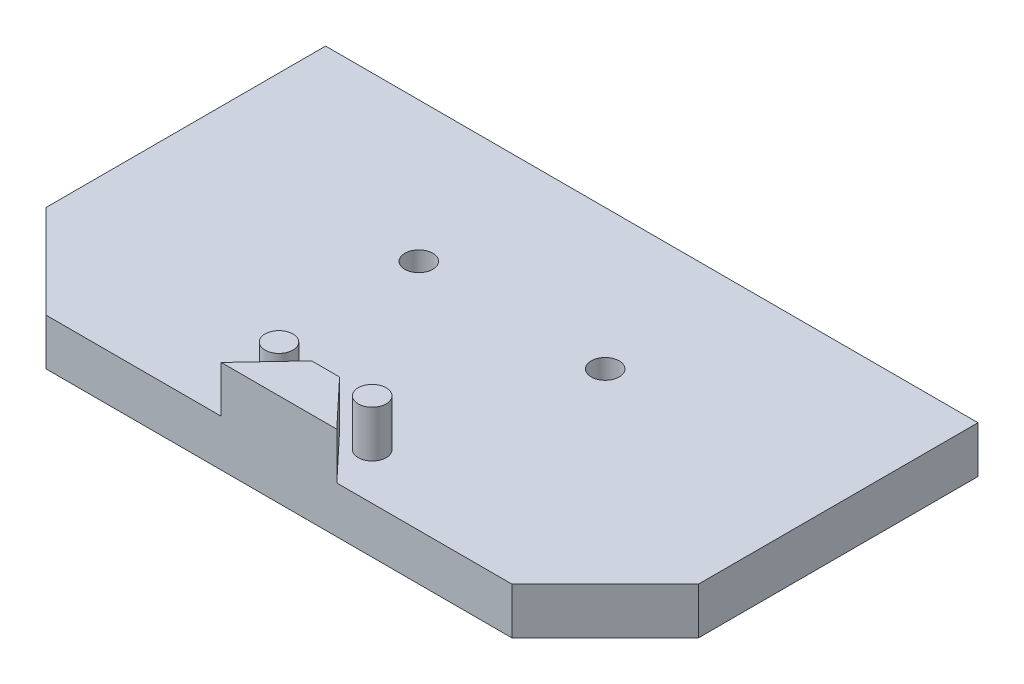
ISO-10303-21;
HEADER;
FILE_DESCRIPTION(('STEP AP214'),'2;1');
FILE_NAME('part.step','',(''),(''),'','','');
FILE_SCHEMA(('AUTOMOTIVE_DESIGN { 1 0 10303 214 1 1 1 1 }'));
ENDSEC;
DATA;
#1=APPLICATION_CONTEXT('core data for automotive mechanical design processes');
#2=APPLICATION_PROTOCOL_DEFINITION('international standard','automotive_design',2000,#1);
#3=PRODUCT_CONTEXT('',#1,'mechanical');
#4=PRODUCT('Part','Part','',(#3));
#5=PRODUCT_RELATED_PRODUCT_CATEGORY('part','',(#4));
#6=PRODUCT_DEFINITION_FORMATION('','',#4);
#7=PRODUCT_DEFINITION_CONTEXT('part definition',#1,'design');
#8=PRODUCT_DEFINITION('design','',#6,#7);
#9=PRODUCT_DEFINITION_SHAPE('','',#8);
#10=(LENGTH_UNIT() NAMED_UNIT(*) SI_UNIT(.MILLI.,.METRE.));
#11=(NAMED_UNIT(*) PLANE_ANGLE_UNIT() SI_UNIT($,.RADIAN.));
#12=(NAMED_UNIT(*) SI_UNIT($,.STERADIAN.) SOLID_ANGLE_UNIT());
#13=UNCERTAINTY_MEASURE_WITH_UNIT(LENGTH_MEASURE(1.E-05),#10,'distance_accuracy_value','');
#14=(GEOMETRIC_REPRESENTATION_CONTEXT(3) GLOBAL_UNCERTAINTY_ASSIGNED_CONTEXT((#13)) GLOBAL_UNIT_ASSIGNED_CONTEXT((#10,
#11,#12)) REPRESENTATION_CONTEXT('',''));
#15=CARTESIAN_POINT('',(0.,0.,0.));
#16=DIRECTION('',(0.,0.,1.));
#17=DIRECTION('',(1.,0.,0.));
#18=AXIS2_PLACEMENT_3D('',#15,#16,#17);
#19=CARTESIAN_POINT('',(0.,5.,0.));
#20=DIRECTION('',(0.,1.,0.));
#21=DIRECTION('',(0.,0.,1.));
#22=AXIS2_PLACEMENT_3D('',#19,#20,#21);
#23=PLANE('',#22);
#24=CARTESIAN_POINT('',(5.,5.,15.));
#25=DIRECTION('',(0.,1.,0.));
#26=DIRECTION('',(0.,0.,1.));
#27=AXIS2_PLACEMENT_3D('',#24,#25,#26);
#28=CIRCLE('',#27,1.5);
#29=CARTESIAN_POINT('',(5.,5.,16.5));
#30=VERTEX_POINT('',#29);
#31=EDGE_CURVE('E151',#30,#30,#28,.T.);
#32=ORIENTED_EDGE('',*,*,#31,.F.);
#33=EDGE_LOOP('',(#32));
#34=FACE_BOUND('',#33,.T.);
#35=CARTESIAN_POINT('',(-10.,5.,-5.00000000000001));
#36=DIRECTION('',(0.,1.,0.));
#37=DIRECTION('',(0.,0.,1.));
#38=AXIS2_PLACEMENT_3D('',#35,#36,#37);
#39=CIRCLE('',#38,1.5);
#40=CARTESIAN_POINT('',(-10.,5.,-3.50000000000001));
#41=VERTEX_POINT('',#40);
#42=EDGE_CURVE('E168',#41,#41,#39,.T.);
#43=ORIENTED_EDGE('',*,*,#42,.F.);
#44=EDGE_LOOP('',(#43));
#45=FACE_BOUND('',#44,.T.);
#46=CARTESIAN_POINT('',(10.,5.,-5.00000000000001));
#47=DIRECTION('',(0.,1.,0.));
#48=DIRECTION('',(0.,0.,1.));
#49=AXIS2_PLACEMENT_3D('',#46,#47,#48);
#50=CIRCLE('',#49,1.5);
#51=CARTESIAN_POINT('',(10.,5.,-3.50000000000001));
#52=VERTEX_POINT('',#51);
#53=EDGE_CURVE('E162',#52,#52,#50,.T.);
#54=ORIENTED_EDGE('',*,*,#53,.F.);
#55=EDGE_LOOP('',(#54));
#56=FACE_BOUND('',#55,.T.);
#57=CARTESIAN_POINT('',(-5.,5.,15.));
#58=DIRECTION('',(0.,1.,0.));
#59=DIRECTION('',(0.,0.,1.));
#60=AXIS2_PLACEMENT_3D('',#57,#58,#59);
#61=CIRCLE('',#60,1.5);
#62=CARTESIAN_POINT('',(-5.,5.,16.5));
#63=VERTEX_POINT('',#62);
#64=EDGE_CURVE('E156',#63,#63,#61,.T.);
#65=ORIENTED_EDGE('',*,*,#64,.F.);
#66=EDGE_LOOP('',(#65));
#67=FACE_BOUND('',#66,.T.);
#68=DIRECTION('',(1.,0.,0.));
#69=VECTOR('',#68,1.);
#70=CARTESIAN_POINT('',(35.,5.,20.));
#71=LINE('',#70,#69);
#72=CARTESIAN_POINT('',(-25.,5.,20.));
#73=VERTEX_POINT('',#72);
#74=CARTESIAN_POINT('',(-6.2,5.,20.));
#75=VERTEX_POINT('',#74);
#76=EDGE_CURVE('E182',#73,#75,#71,.T.);
#77=ORIENTED_EDGE('',*,*,#76,.T.);
#78=DIRECTION('',(-0.684910008767886,0.,0.728627668902008));
#79=VECTOR('',#78,1.);
#80=CARTESIAN_POINT('',(-1.5,5.,15.));
#81=LINE('',#80,#79);
#82=CARTESIAN_POINT('',(-1.5,5.,15.));
#83=VERTEX_POINT('',#82);
#84=EDGE_CURVE('E53',#83,#75,#81,.T.);
#85=ORIENTED_EDGE('',*,*,#84,.F.);
#86=DIRECTION('',(-1.,0.,0.));
#87=VECTOR('',#86,1.);
#88=CARTESIAN_POINT('',(1.5,5.,15.));
#89=LINE('',#88,#87);
#90=CARTESIAN_POINT('',(1.5,5.,15.));
#91=VERTEX_POINT('',#90);
#92=EDGE_CURVE('E48',#91,#83,#89,.T.);
#93=ORIENTED_EDGE('',*,*,#92,.F.);
#94=DIRECTION('',(-0.684910008767887,0.,-0.728627668902007));
#95=VECTOR('',#94,1.);
#96=CARTESIAN_POINT('',(6.2,5.,20.));
#97=LINE('',#96,#95);
#98=CARTESIAN_POINT('',(6.2,5.,20.));
#99=VERTEX_POINT('',#98);
#100=EDGE_CURVE('E223',#99,#91,#97,.T.);
#101=ORIENTED_EDGE('',*,*,#100,.F.);
#102=CARTESIAN_POINT('',(25.,5.,20.));
#103=VERTEX_POINT('',#102);
#104=EDGE_CURVE('E180',#99,#103,#71,.T.);
#105=ORIENTED_EDGE('',*,*,#104,.T.);
#106=DIRECTION('',(-0.707106781186547,0.,0.707106781186548));
#107=VECTOR('',#106,1.);
#108=CARTESIAN_POINT('',(25.,5.,20.));
#109=LINE('',#108,#107);
#110=CARTESIAN_POINT('',(35.,5.,9.99999999999999));
#111=VERTEX_POINT('',#110);
#112=EDGE_CURVE('E132',#111,#103,#109,.T.);
#113=ORIENTED_EDGE('',*,*,#112,.F.);
#114=DIRECTION('',(0.,0.,-1.));
#115=VECTOR('',#114,1.);
#116=CARTESIAN_POINT('',(35.,5.,20.));
#117=LINE('',#116,#115);
#118=CARTESIAN_POINT('',(35.,5.,-20.));
#119=VERTEX_POINT('',#118);
#120=EDGE_CURVE('E184',#111,#119,#117,.T.);
#121=ORIENTED_EDGE('',*,*,#120,.T.);
#122=DIRECTION('',(-1.,0.,0.));
#123=VECTOR('',#122,1.);
#124=CARTESIAN_POINT('',(35.,5.,-20.));
#125=LINE('',#124,#123);
#126=CARTESIAN_POINT('',(-35.,5.,-20.));
#127=VERTEX_POINT('',#126);
#128=EDGE_CURVE('E186',#119,#127,#125,.T.);
#129=ORIENTED_EDGE('',*,*,#128,.T.);
#130=DIRECTION('',(0.,0.,1.));
#131=VECTOR('',#130,1.);
#132=CARTESIAN_POINT('',(-35.,5.,20.));
#133=LINE('',#132,#131);
#134=CARTESIAN_POINT('',(-35.,5.,10.));
#135=VERTEX_POINT('',#134);
#136=EDGE_CURVE('E177',#127,#135,#133,.T.);
#137=ORIENTED_EDGE('',*,*,#136,.T.);
#138=DIRECTION('',(-0.707106781186548,0.,-0.707106781186547));
#139=VECTOR('',#138,1.);
#140=CARTESIAN_POINT('',(-25.,5.,20.));
#141=LINE('',#140,#139);
#142=EDGE_CURVE('E144',#73,#135,#141,.T.);
#143=ORIENTED_EDGE('',*,*,#142,.F.);
#144=EDGE_LOOP('',(#77,#85,#93,#101,#105,#113,#121,#129,#137,#143));
#145=FACE_BOUND('',#144,.T.);
#146=ADVANCED_FACE('F33',(#34,#45,#56,#67,#145),#23,.T.);
#147=CARTESIAN_POINT('',(-35.,5.,20.));
#148=DIRECTION('',(1.,0.,0.));
#149=DIRECTION('',(0.,0.,-1.));
#150=AXIS2_PLACEMENT_3D('',#147,#148,#149);
#151=PLANE('',#150);
#152=DIRECTION('',(0.,0.,1.));
#153=VECTOR('',#152,1.);
#154=CARTESIAN_POINT('',(-35.,0.,20.));
#155=LINE('',#154,#153);
#156=CARTESIAN_POINT('',(-35.,0.,-20.));
#157=VERTEX_POINT('',#156);
#158=CARTESIAN_POINT('',(-35.,0.,10.));
#159=VERTEX_POINT('',#158);
#160=EDGE_CURVE('E174',#157,#159,#155,.T.);
#161=ORIENTED_EDGE('',*,*,#160,.T.);
#162=DIRECTION('',(0.,1.,0.));
#163=VECTOR('',#162,1.);
#164=CARTESIAN_POINT('',(-35.,-5.,10.));
#165=LINE('',#164,#163);
#166=EDGE_CURVE('E148',#159,#135,#165,.T.);
#167=ORIENTED_EDGE('',*,*,#166,.T.);
#168=ORIENTED_EDGE('',*,*,#136,.F.);
#169=DIRECTION('',(0.,-1.,0.));
#170=VECTOR('',#169,1.);
#171=CARTESIAN_POINT('',(-35.,5.,-20.));
#172=LINE('',#171,#170);
#173=EDGE_CURVE('E188',#127,#157,#172,.T.);
#174=ORIENTED_EDGE('',*,*,#173,.T.);
#175=EDGE_LOOP('',(#161,#167,#168,#174));
#176=FACE_BOUND('',#175,.T.);
#177=ADVANCED_FACE('F35',(#176),#151,.F.);
#178=CARTESIAN_POINT('',(35.,5.,20.));
#179=DIRECTION('',(0.,0.,-1.));
#180=DIRECTION('',(-1.,0.,0.));
#181=AXIS2_PLACEMENT_3D('',#178,#179,#180);
#182=PLANE('',#181);
#183=DIRECTION('',(1.,0.,0.));
#184=VECTOR('',#183,1.);
#185=CARTESIAN_POINT('',(35.,0.,20.));
#186=LINE('',#185,#184);
#187=CARTESIAN_POINT('',(-25.,0.,20.));
#188=VERTEX_POINT('',#187);
#189=CARTESIAN_POINT('',(25.,0.,20.));
#190=VERTEX_POINT('',#189);
#191=EDGE_CURVE('E191',#188,#190,#186,.T.);
#192=ORIENTED_EDGE('',*,*,#191,.T.);
#193=DIRECTION('',(0.,1.,0.));
#194=VECTOR('',#193,1.);
#195=CARTESIAN_POINT('',(25.,-5.,20.));
#196=LINE('',#195,#194);
#197=EDGE_CURVE('E141',#190,#103,#196,.T.);
#198=ORIENTED_EDGE('',*,*,#197,.T.);
#199=ORIENTED_EDGE('',*,*,#104,.F.);
#200=DIRECTION('',(0.,-1.,0.));
#201=VECTOR('',#200,1.);
#202=CARTESIAN_POINT('',(6.2,10.,20.));
#203=LINE('',#202,#201);
#204=CARTESIAN_POINT('',(6.2,10.,20.));
#205=VERTEX_POINT('',#204);
#206=EDGE_CURVE('E117',#205,#99,#203,.T.);
#207=ORIENTED_EDGE('',*,*,#206,.F.);
#208=DIRECTION('',(1.,0.,0.));
#209=VECTOR('',#208,1.);
#210=CARTESIAN_POINT('',(-6.2,10.,20.));
#211=LINE('',#210,#209);
#212=CARTESIAN_POINT('',(-6.2,10.,20.));
#213=VERTEX_POINT('',#212);
#214=EDGE_CURVE('E109',#213,#205,#211,.T.);
#215=ORIENTED_EDGE('',*,*,#214,.F.);
#216=DIRECTION('',(0.,-1.,0.));
#217=VECTOR('',#216,1.);
#218=CARTESIAN_POINT('',(-6.2,10.,20.));
#219=LINE('',#218,#217);
#220=EDGE_CURVE('E115',#213,#75,#219,.T.);
#221=ORIENTED_EDGE('',*,*,#220,.T.);
#222=ORIENTED_EDGE('',*,*,#76,.F.);
#223=DIRECTION('',(0.,1.,0.));
#224=VECTOR('',#223,1.);
#225=CARTESIAN_POINT('',(-25.,-5.,20.));
#226=LINE('',#225,#224);
#227=EDGE_CURVE('E147',#188,#73,#226,.T.);
#228=ORIENTED_EDGE('',*,*,#227,.F.);
#229=EDGE_LOOP('',(#192,#198,#199,#207,#215,#221,#222,#228));
#230=FACE_BOUND('',#229,.T.);
#231=ADVANCED_FACE('F112',(#230),#182,.F.);
#232=CARTESIAN_POINT('',(35.,5.,20.));
#233=DIRECTION('',(-1.,0.,0.));
#234=DIRECTION('',(0.,0.,1.));
#235=AXIS2_PLACEMENT_3D('',#232,#233,#234);
#236=PLANE('',#235);
#237=ORIENTED_EDGE('',*,*,#120,.F.);
#238=DIRECTION('',(0.,1.,0.));
#239=VECTOR('',#238,1.);
#240=CARTESIAN_POINT('',(35.,-5.,9.99999999999999));
#241=LINE('',#240,#239);
#242=CARTESIAN_POINT('',(35.,0.,9.99999999999999));
#243=VERTEX_POINT('',#242);
#244=EDGE_CURVE('E135',#243,#111,#241,.T.);
#245=ORIENTED_EDGE('',*,*,#244,.F.);
#246=DIRECTION('',(0.,0.,-1.));
#247=VECTOR('',#246,1.);
#248=CARTESIAN_POINT('',(35.,0.,20.));
#249=LINE('',#248,#247);
#250=CARTESIAN_POINT('',(35.,0.,-20.));
#251=VERTEX_POINT('',#250);
#252=EDGE_CURVE('E193',#243,#251,#249,.T.);
#253=ORIENTED_EDGE('',*,*,#252,.T.);
#254=DIRECTION('',(0.,-1.,0.));
#255=VECTOR('',#254,1.);
#256=CARTESIAN_POINT('',(35.,5.,-20.));
#257=LINE('',#256,#255);
#258=EDGE_CURVE('E198',#119,#251,#257,.T.);
#259=ORIENTED_EDGE('',*,*,#258,.F.);
#260=EDGE_LOOP('',(#237,#245,#253,#259));
#261=FACE_BOUND('',#260,.T.);
#262=ADVANCED_FACE('F219',(#261),#236,.F.);
#263=CARTESIAN_POINT('',(35.,5.,-20.));
#264=DIRECTION('',(0.,0.,1.));
#265=DIRECTION('',(1.,0.,0.));
#266=AXIS2_PLACEMENT_3D('',#263,#264,#265);
#267=PLANE('',#266);
#268=DIRECTION('',(-1.,0.,0.));
#269=VECTOR('',#268,1.);
#270=CARTESIAN_POINT('',(35.,0.,-20.));
#271=LINE('',#270,#269);
#272=EDGE_CURVE('E181',#251,#157,#271,.T.);
#273=ORIENTED_EDGE('',*,*,#272,.T.);
#274=ORIENTED_EDGE('',*,*,#173,.F.);
#275=ORIENTED_EDGE('',*,*,#128,.F.);
#276=ORIENTED_EDGE('',*,*,#258,.T.);
#277=EDGE_LOOP('',(#273,#274,#275,#276));
#278=FACE_BOUND('',#277,.T.);
#279=ADVANCED_FACE('F214',(#278),#267,.F.);
#280=CARTESIAN_POINT('',(0.,0.,0.));
#281=DIRECTION('',(0.,1.,0.));
#282=DIRECTION('',(0.,0.,1.));
#283=AXIS2_PLACEMENT_3D('',#280,#281,#282);
#284=PLANE('',#283);
#285=CARTESIAN_POINT('',(10.,0.,-5.00000000000001));
#286=DIRECTION('',(0.,1.,0.));
#287=DIRECTION('',(0.,0.,1.));
#288=AXIS2_PLACEMENT_3D('',#285,#286,#287);
#289=CIRCLE('',#288,1.5);
#290=CARTESIAN_POINT('',(10.,0.,-3.50000000000001));
#291=VERTEX_POINT('',#290);
#292=EDGE_CURVE('E165',#291,#291,#289,.T.);
#293=ORIENTED_EDGE('',*,*,#292,.T.);
#294=EDGE_LOOP('',(#293));
#295=FACE_BOUND('',#294,.T.);
#296=CARTESIAN_POINT('',(-10.,0.,-5.00000000000001));
#297=DIRECTION('',(0.,1.,0.));
#298=DIRECTION('',(0.,0.,1.));
#299=AXIS2_PLACEMENT_3D('',#296,#297,#298);
#300=CIRCLE('',#299,1.5);
#301=CARTESIAN_POINT('',(-10.,0.,-3.50000000000001));
#302=VERTEX_POINT('',#301);
#303=EDGE_CURVE('E171',#302,#302,#300,.T.);
#304=ORIENTED_EDGE('',*,*,#303,.T.);
#305=EDGE_LOOP('',(#304));
#306=FACE_BOUND('',#305,.T.);
#307=ORIENTED_EDGE('',*,*,#252,.F.);
#308=DIRECTION('',(-0.707106781186547,0.,0.707106781186548));
#309=VECTOR('',#308,1.);
#310=CARTESIAN_POINT('',(22.5,0.,22.5));
#311=LINE('',#310,#309);
#312=EDGE_CURVE('E11',#243,#190,#311,.T.);
#313=ORIENTED_EDGE('',*,*,#312,.T.);
#314=ORIENTED_EDGE('',*,*,#191,.F.);
#315=DIRECTION('',(-0.707106781186548,0.,-0.707106781186547));
#316=VECTOR('',#315,1.);
#317=CARTESIAN_POINT('',(-22.5,0.,22.5));
#318=LINE('',#317,#316);
#319=EDGE_CURVE('E41',#188,#159,#318,.T.);
#320=ORIENTED_EDGE('',*,*,#319,.T.);
#321=ORIENTED_EDGE('',*,*,#160,.F.);
#322=ORIENTED_EDGE('',*,*,#272,.F.);
#323=EDGE_LOOP('',(#307,#313,#314,#320,#321,#322));
#324=FACE_BOUND('',#323,.T.);
#325=ADVANCED_FACE('F205',(#295,#306,#324),#284,.F.);
#326=CARTESIAN_POINT('',(-10.,0.,-5.00000000000001));
#327=DIRECTION('',(0.,1.,0.));
#328=DIRECTION('',(0.,0.,1.));
#329=AXIS2_PLACEMENT_3D('',#326,#327,#328);
#330=CYLINDRICAL_SURFACE('',#329,1.5);
#331=ORIENTED_EDGE('',*,*,#303,.F.);
#332=EDGE_LOOP('',(#331));
#333=FACE_BOUND('',#332,.T.);
#334=ORIENTED_EDGE('',*,*,#42,.T.);
#335=EDGE_LOOP('',(#334));
#336=FACE_BOUND('',#335,.T.);
#337=ADVANCED_FACE('F249',(#333,#336),#330,.F.);
#338=CARTESIAN_POINT('',(10.,0.,-5.00000000000001));
#339=DIRECTION('',(0.,1.,0.));
#340=DIRECTION('',(0.,0.,1.));
#341=AXIS2_PLACEMENT_3D('',#338,#339,#340);
#342=CYLINDRICAL_SURFACE('',#341,1.5);
#343=ORIENTED_EDGE('',*,*,#292,.F.);
#344=EDGE_LOOP('',(#343));
#345=FACE_BOUND('',#344,.T.);
#346=ORIENTED_EDGE('',*,*,#53,.T.);
#347=EDGE_LOOP('',(#346));
#348=FACE_BOUND('',#347,.T.);
#349=ADVANCED_FACE('F345',(#345,#348),#342,.F.);
#350=CARTESIAN_POINT('',(-5.,10.,15.));
#351=DIRECTION('',(0.,-1.,0.));
#352=DIRECTION('',(0.,0.,-1.));
#353=AXIS2_PLACEMENT_3D('',#350,#351,#352);
#354=CYLINDRICAL_SURFACE('',#353,1.5);
#355=CARTESIAN_POINT('',(-5.,10.,15.));
#356=DIRECTION('',(0.,1.,0.));
#357=DIRECTION('',(0.,0.,1.));
#358=AXIS2_PLACEMENT_3D('',#355,#356,#357);
#359=CIRCLE('',#358,1.5);
#360=CARTESIAN_POINT('',(-5.,10.,16.5));
#361=VERTEX_POINT('',#360);
#362=EDGE_CURVE('E159',#361,#361,#359,.T.);
#363=ORIENTED_EDGE('',*,*,#362,.F.);
#364=EDGE_LOOP('',(#363));
#365=FACE_BOUND('',#364,.T.);
#366=ORIENTED_EDGE('',*,*,#64,.T.);
#367=EDGE_LOOP('',(#366));
#368=FACE_BOUND('',#367,.T.);
#369=ADVANCED_FACE('F336',(#365,#368),#354,.T.);
#370=CARTESIAN_POINT('',(-5.,10.,15.));
#371=DIRECTION('',(0.,1.,0.));
#372=DIRECTION('',(0.,0.,1.));
#373=AXIS2_PLACEMENT_3D('',#370,#371,#372);
#374=PLANE('',#373);
#375=ORIENTED_EDGE('',*,*,#362,.T.);
#376=EDGE_LOOP('',(#375));
#377=FACE_BOUND('',#376,.T.);
#378=ADVANCED_FACE('F327',(#377),#374,.T.);
#379=CARTESIAN_POINT('',(5.,10.,15.));
#380=DIRECTION('',(0.,-1.,0.));
#381=DIRECTION('',(0.,0.,-1.));
#382=AXIS2_PLACEMENT_3D('',#379,#380,#381);
#383=CYLINDRICAL_SURFACE('',#382,1.5);
#384=CARTESIAN_POINT('',(5.,10.,15.));
#385=DIRECTION('',(0.,1.,0.));
#386=DIRECTION('',(0.,0.,1.));
#387=AXIS2_PLACEMENT_3D('',#384,#385,#386);
#388=CIRCLE('',#387,1.5);
#389=CARTESIAN_POINT('',(5.,10.,16.5));
#390=VERTEX_POINT('',#389);
#391=EDGE_CURVE('E153',#390,#390,#388,.T.);
#392=ORIENTED_EDGE('',*,*,#391,.F.);
#393=EDGE_LOOP('',(#392));
#394=FACE_BOUND('',#393,.T.);
#395=ORIENTED_EDGE('',*,*,#31,.T.);
#396=EDGE_LOOP('',(#395));
#397=FACE_BOUND('',#396,.T.);
#398=ADVANCED_FACE('F234',(#394,#397),#383,.T.);
#399=CARTESIAN_POINT('',(5.,10.,15.));
#400=DIRECTION('',(0.,1.,0.));
#401=DIRECTION('',(0.,0.,1.));
#402=AXIS2_PLACEMENT_3D('',#399,#400,#401);
#403=PLANE('',#402);
#404=ORIENTED_EDGE('',*,*,#391,.T.);
#405=EDGE_LOOP('',(#404));
#406=FACE_BOUND('',#405,.T.);
#407=ADVANCED_FACE('F227',(#406),#403,.T.);
#408=CARTESIAN_POINT('',(-25.,-5.,20.));
#409=DIRECTION('',(0.707106781186547,0.,-0.707106781186548));
#410=DIRECTION('',(-0.707106781186548,0.,-0.707106781186547));
#411=AXIS2_PLACEMENT_3D('',#408,#409,#410);
#412=PLANE('',#411);
#413=ORIENTED_EDGE('',*,*,#227,.T.);
#414=ORIENTED_EDGE('',*,*,#142,.T.);
#415=ORIENTED_EDGE('',*,*,#166,.F.);
#416=ORIENTED_EDGE('',*,*,#319,.F.);
#417=EDGE_LOOP('',(#413,#414,#415,#416));
#418=FACE_BOUND('',#417,.T.);
#419=ADVANCED_FACE('F225',(#418),#412,.F.);
#420=CARTESIAN_POINT('',(25.,-5.,20.));
#421=DIRECTION('',(-0.707106781186548,0.,-0.707106781186547));
#422=DIRECTION('',(-0.707106781186547,0.,0.707106781186548));
#423=AXIS2_PLACEMENT_3D('',#420,#421,#422);
#424=PLANE('',#423);
#425=ORIENTED_EDGE('',*,*,#244,.T.);
#426=ORIENTED_EDGE('',*,*,#112,.T.);
#427=ORIENTED_EDGE('',*,*,#197,.F.);
#428=ORIENTED_EDGE('',*,*,#312,.F.);
#429=EDGE_LOOP('',(#425,#426,#427,#428));
#430=FACE_BOUND('',#429,.T.);
#431=ADVANCED_FACE('F222',(#430),#424,.F.);
#432=CARTESIAN_POINT('',(-1.5,10.,15.));
#433=DIRECTION('',(0.728627668902008,0.,0.684910008767886));
#434=DIRECTION('',(0.684910008767886,0.,-0.728627668902008));
#435=AXIS2_PLACEMENT_3D('',#432,#433,#434);
#436=PLANE('',#435);
#437=ORIENTED_EDGE('',*,*,#84,.T.);
#438=ORIENTED_EDGE('',*,*,#220,.F.);
#439=DIRECTION('',(-0.684910008767886,0.,0.728627668902008));
#440=VECTOR('',#439,1.);
#441=CARTESIAN_POINT('',(-1.5,10.,15.));
#442=LINE('',#441,#440);
#443=CARTESIAN_POINT('',(-1.5,10.,15.));
#444=VERTEX_POINT('',#443);
#445=EDGE_CURVE('E121',#444,#213,#442,.T.);
#446=ORIENTED_EDGE('',*,*,#445,.F.);
#447=DIRECTION('',(0.,-1.,0.));
#448=VECTOR('',#447,1.);
#449=CARTESIAN_POINT('',(-1.5,10.,15.));
#450=LINE('',#449,#448);
#451=EDGE_CURVE('E406',#444,#83,#450,.T.);
#452=ORIENTED_EDGE('',*,*,#451,.T.);
#453=EDGE_LOOP('',(#437,#438,#446,#452));
#454=FACE_BOUND('',#453,.T.);
#455=ADVANCED_FACE('F131',(#454),#436,.F.);
#456=CARTESIAN_POINT('',(6.2,10.,20.));
#457=DIRECTION('',(-0.728627668902007,0.,0.684910008767887));
#458=DIRECTION('',(0.684910008767887,0.,0.728627668902007));
#459=AXIS2_PLACEMENT_3D('',#456,#457,#458);
#460=PLANE('',#459);
#461=ORIENTED_EDGE('',*,*,#100,.T.);
#462=DIRECTION('',(0.,-1.,0.));
#463=VECTOR('',#462,1.);
#464=CARTESIAN_POINT('',(1.5,10.,15.));
#465=LINE('',#464,#463);
#466=CARTESIAN_POINT('',(1.5,10.,15.));
#467=VERTEX_POINT('',#466);
#468=EDGE_CURVE('E137',#467,#91,#465,.T.);
#469=ORIENTED_EDGE('',*,*,#468,.F.);
#470=DIRECTION('',(-0.684910008767887,0.,-0.728627668902007));
#471=VECTOR('',#470,1.);
#472=CARTESIAN_POINT('',(6.2,10.,20.));
#473=LINE('',#472,#471);
#474=EDGE_CURVE('E120',#205,#467,#473,.T.);
#475=ORIENTED_EDGE('',*,*,#474,.F.);
#476=ORIENTED_EDGE('',*,*,#206,.T.);
#477=EDGE_LOOP('',(#461,#469,#475,#476));
#478=FACE_BOUND('',#477,.T.);
#479=ADVANCED_FACE('F267',(#478),#460,.F.);
#480=CARTESIAN_POINT('',(1.5,10.,15.));
#481=DIRECTION('',(0.,0.,1.));
#482=DIRECTION('',(1.,0.,0.));
#483=AXIS2_PLACEMENT_3D('',#480,#481,#482);
#484=PLANE('',#483);
#485=ORIENTED_EDGE('',*,*,#92,.T.);
#486=ORIENTED_EDGE('',*,*,#451,.F.);
#487=DIRECTION('',(-1.,0.,0.));
#488=VECTOR('',#487,1.);
#489=CARTESIAN_POINT('',(1.5,10.,15.));
#490=LINE('',#489,#488);
#491=EDGE_CURVE('E126',#467,#444,#490,.T.);
#492=ORIENTED_EDGE('',*,*,#491,.F.);
#493=ORIENTED_EDGE('',*,*,#468,.T.);
#494=EDGE_LOOP('',(#485,#486,#492,#493));
#495=FACE_BOUND('',#494,.T.);
#496=ADVANCED_FACE('F274',(#495),#484,.F.);
#497=CARTESIAN_POINT('',(0.,10.,0.));
#498=DIRECTION('',(0.,-1.,0.));
#499=DIRECTION('',(0.,0.,-1.));
#500=AXIS2_PLACEMENT_3D('',#497,#498,#499);
#501=PLANE('',#500);
#502=ORIENTED_EDGE('',*,*,#445,.T.);
#503=ORIENTED_EDGE('',*,*,#214,.T.);
#504=ORIENTED_EDGE('',*,*,#474,.T.);
#505=ORIENTED_EDGE('',*,*,#491,.T.);
#506=EDGE_LOOP('',(#502,#503,#504,#505));
#507=FACE_BOUND('',#506,.T.);
#508=ADVANCED_FACE('F124',(#507),#501,.F.);
#509=CLOSED_SHELL('',(#146,#177,#231,#262,#279,#325,#337,#349,#369,#378,#398,#407,#419,#431,
#455,#479,#496,#508));
#510=MANIFOLD_SOLID_BREP('B2',#509);
#511=ADVANCED_BREP_SHAPE_REPRESENTATION('',(#18,#510),#14);
#512=SHAPE_DEFINITION_REPRESENTATION(#9,#511);
ENDSEC;
END-ISO-10303-21;
